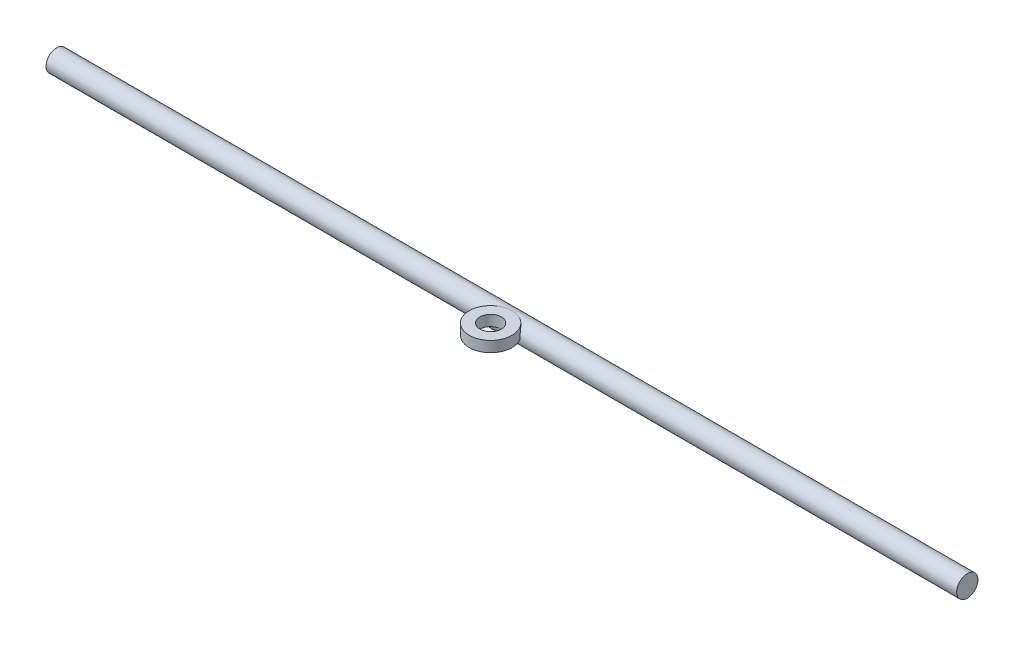
ISO-10303-21;
HEADER;
FILE_DESCRIPTION(('STEP AP214'),'2;1');
FILE_NAME('part.step','',(''),(''),'','','');
FILE_SCHEMA(('AUTOMOTIVE_DESIGN { 1 0 10303 214 1 1 1 1 }'));
ENDSEC;
DATA;
#1=APPLICATION_CONTEXT('core data for automotive mechanical design processes');
#2=APPLICATION_PROTOCOL_DEFINITION('international standard','automotive_design',2000,#1);
#3=PRODUCT_CONTEXT('',#1,'mechanical');
#4=PRODUCT('Part','Part','',(#3));
#5=PRODUCT_RELATED_PRODUCT_CATEGORY('part','',(#4));
#6=PRODUCT_DEFINITION_FORMATION('','',#4);
#7=PRODUCT_DEFINITION_CONTEXT('part definition',#1,'design');
#8=PRODUCT_DEFINITION('design','',#6,#7);
#9=PRODUCT_DEFINITION_SHAPE('','',#8);
#10=(LENGTH_UNIT() NAMED_UNIT(*) SI_UNIT(.MILLI.,.METRE.));
#11=(NAMED_UNIT(*) PLANE_ANGLE_UNIT() SI_UNIT($,.RADIAN.));
#12=(NAMED_UNIT(*) SI_UNIT($,.STERADIAN.) SOLID_ANGLE_UNIT());
#13=UNCERTAINTY_MEASURE_WITH_UNIT(LENGTH_MEASURE(1.E-05),#10,'distance_accuracy_value','');
#14=(GEOMETRIC_REPRESENTATION_CONTEXT(3) GLOBAL_UNCERTAINTY_ASSIGNED_CONTEXT((#13)) GLOBAL_UNIT_ASSIGNED_CONTEXT((#10,
#11,#12)) REPRESENTATION_CONTEXT('',''));
#15=CARTESIAN_POINT('',(0.,0.,0.));
#16=DIRECTION('',(0.,0.,1.));
#17=DIRECTION('',(1.,0.,0.));
#18=AXIS2_PLACEMENT_3D('',#15,#16,#17);
#19=CARTESIAN_POINT('',(-213.333333333333,0.,0.));
#20=DIRECTION('',(1.,0.,0.));
#21=DIRECTION('',(0.,0.,-1.));
#22=AXIS2_PLACEMENT_3D('',#19,#20,#21);
#23=CYLINDRICAL_SURFACE('',#22,5.);
#24=CARTESIAN_POINT('',(213.333333333333,0.,0.));
#25=DIRECTION('',(1.,0.,0.));
#26=DIRECTION('',(0.,0.,-1.));
#27=AXIS2_PLACEMENT_3D('',#24,#25,#26);
#28=CIRCLE('',#27,5.);
#29=CARTESIAN_POINT('',(213.333333333333,0.,-5.));
#30=VERTEX_POINT('',#29);
#31=EDGE_CURVE('E89',#30,#30,#28,.T.);
#32=ORIENTED_EDGE('',*,*,#31,.F.);
#33=EDGE_LOOP('',(#32));
#34=FACE_BOUND('',#33,.T.);
#35=CARTESIAN_POINT('',(-213.333333333333,0.,0.));
#36=DIRECTION('',(1.,0.,0.));
#37=DIRECTION('',(0.,0.,-1.));
#38=AXIS2_PLACEMENT_3D('',#35,#36,#37);
#39=CIRCLE('',#38,5.);
#40=CARTESIAN_POINT('',(-213.333333333333,0.,-5.));
#41=VERTEX_POINT('',#40);
#42=EDGE_CURVE('E135',#41,#41,#39,.T.);
#43=ORIENTED_EDGE('',*,*,#42,.T.);
#44=EDGE_LOOP('',(#43));
#45=FACE_BOUND('',#44,.T.);
#46=CARTESIAN_POINT('',(0.,5.,0.));
#47=CARTESIAN_POINT('',(0.139800140532805,4.99998914216106,-1.64953411774006E-06));
#48=CARTESIAN_POINT('',(0.279599008612205,4.99999971712435,0.00293161128916269));
#49=CARTESIAN_POINT('',(0.558951182691962,4.99998481796157,0.0146552817651165));
#50=CARTESIAN_POINT('',(0.698504488279619,4.99995934377498,0.0234457012520745));
#51=CARTESIAN_POINT('',(0.977171774875295,4.99979340151413,0.0468751978808742));
#52=CARTESIAN_POINT('',(1.11628558128742,4.99965289239646,0.0615163615597334));
#53=CARTESIAN_POINT('',(1.39376674870488,4.99909670772593,0.096617866777976));
#54=CARTESIAN_POINT('',(1.53213411181994,4.99868103295118,0.117078191861396));
#55=CARTESIAN_POINT('',(1.94736630640988,4.99671275391144,0.187413617385381));
#56=CARTESIAN_POINT('',(2.22278832364154,4.99443550926618,0.246111117331495));
#57=CARTESIAN_POINT('',(2.76755428049912,4.98553578349395,0.386481190947482));
#58=CARTESIAN_POINT('',(3.03689988080349,4.97891450484001,0.46814740306997));
#59=CARTESIAN_POINT('',(3.51745927684456,4.95992802984724,0.636266400188529));
#60=CARTESIAN_POINT('',(3.73006013603067,4.94888089289344,0.718914864376468));
#61=CARTESIAN_POINT('',(4.14872659779974,4.91947428900589,0.89835629569658));
#62=CARTESIAN_POINT('',(4.35479211064774,4.90111472171414,0.99514945694328));
#63=CARTESIAN_POINT('',(4.7583706125626,4.8545819563223,1.20175346244203));
#64=CARTESIAN_POINT('',(4.95590782245111,4.82643893209432,1.31152360430033));
#65=CARTESIAN_POINT('',(5.34147781162199,4.75745956206622,1.54310240884557));
#66=CARTESIAN_POINT('',(5.52951406874083,4.71662790067116,1.66490661748192));
#67=CARTESIAN_POINT('',(5.84244241215245,4.63303893159044,1.88266017635314));
#68=CARTESIAN_POINT('',(5.97009861226641,4.59412330902775,1.97612550752586));
#69=CARTESIAN_POINT('',(6.21886389016391,4.50706149141273,2.16735554517715));
#70=CARTESIAN_POINT('',(6.33997461979957,4.45891763932518,2.26511915551634));
#71=CARTESIAN_POINT('',(6.57478233010431,4.3523420225593,2.46369710064056));
#72=CARTESIAN_POINT('',(6.68848555757562,4.29391908432197,2.56450875711478));
#73=CARTESIAN_POINT('',(6.90778050525223,4.16578673061267,2.76778695237177));
#74=CARTESIAN_POINT('',(7.01337355959722,4.09607917737088,2.87025321559762));
#75=CARTESIAN_POINT('',(7.19884885497205,3.95723959257726,3.05802689584982));
#76=CARTESIAN_POINT('',(7.28008612893296,3.88994068678859,3.1433532868894));
#77=CARTESIAN_POINT('',(7.43599218655022,3.74672632750304,3.31275366062449));
#78=CARTESIAN_POINT('',(7.51066226186664,3.67081257516241,3.39682788688594));
#79=CARTESIAN_POINT('',(7.6531098780371,3.51028955668752,3.56246605522402));
#80=CARTESIAN_POINT('',(7.72088831242561,3.42568142068943,3.6440303217703));
#81=CARTESIAN_POINT('',(7.84932950522482,3.247890318759,3.80334775638808));
#82=CARTESIAN_POINT('',(7.90999216887631,3.15470723866546,3.8811008736993));
#83=CARTESIAN_POINT('',(8.02432408426386,2.95968058802516,4.03181652705226));
#84=CARTESIAN_POINT('',(8.07796079140625,2.85780009224932,4.10475604324047));
#85=CARTESIAN_POINT('',(8.17789455229584,2.64630545640413,4.24418533332557));
#86=CARTESIAN_POINT('',(8.2241913903903,2.53669108924253,4.31067491769469));
#87=CARTESIAN_POINT('',(8.30953242981146,2.31043481699848,4.43605992756374));
#88=CARTESIAN_POINT('',(8.3485731099945,2.19378953624449,4.49495166189195));
#89=CARTESIAN_POINT('',(8.41951139462065,1.95444091978436,4.60406938899334));
#90=CARTESIAN_POINT('',(8.4514097901313,1.83173825682289,4.65429634132172));
#91=CARTESIAN_POINT('',(8.50586855798514,1.59179039811977,4.74142474898931));
#92=CARTESIAN_POINT('',(8.52898701294493,1.47494787963083,4.77908962519889));
#93=CARTESIAN_POINT('',(8.56952899116471,1.23789037463573,4.8459043283864));
#94=CARTESIAN_POINT('',(8.58695281871964,1.11767556870211,4.87505461033661));
#95=CARTESIAN_POINT('',(8.61620888787173,0.875007662598516,4.92439504671448));
#96=CARTESIAN_POINT('',(8.6280519895824,0.752559395383316,4.94460259902243));
#97=CARTESIAN_POINT('',(8.64629291893926,0.506152900605519,4.97586328576335));
#98=CARTESIAN_POINT('',(8.65269409199955,0.382195648302573,4.98692204428533));
#99=CARTESIAN_POINT('',(8.657690107507,0.214989709339041,4.99556148052155));
#100=CARTESIAN_POINT('',(8.65865233930065,0.17198570423535,4.99722669885626));
#101=CARTESIAN_POINT('',(8.65993382375217,0.0859894305317277,4.9994451891233));
#102=CARTESIAN_POINT('',(8.66025382182277,0.0429972063007321,4.99999975014563));
#103=CARTESIAN_POINT('',(8.66025403784456,0.,5.));
#104=B_SPLINE_CURVE_WITH_KNOTS('',3,(#46,#47,#48,#49,#50,#51,#52,#53,#54,#55,#56,#57,#58,#59,
#60,#61,#62,#63,#64,#65,#66,#67,#68,#69,#70,#71,#72,#73,#74,#75,#76,#77,#78,#79,#80,#81,#82,#83,
#84,#85,#86,#87,#88,#89,#90,#91,#92,#93,#94,#95,#96,#97,#98,#99,#100,#101,#102,#103),
.UNSPECIFIED.,.F.,.F.,(4,2,2,2,2,2,2,2,2,2,2,2,2,2,2,2,2,2,2,2,2,2,2,2,2,2,2,2,4),(0.,
0.41936718061986,0.838735065367234,1.25825264195099,1.67776903219588,2.52152207908425,
3.36504166498959,4.04955146499342,4.73407065973913,5.41649713945005,6.09867197890897,
6.58706888878977,7.075341962924,7.56319779516843,8.05097320149911,8.45760945728659,
8.86416555470606,9.27066887277155,9.67717760354036,10.0855073091988,10.4938490097727,
10.9023883489688,11.3108824166217,11.6851895816918,12.0594767422209,12.4330324995092,
12.8063584477875,12.9354852963143,13.0644621860571),.UNSPECIFIED.);
#105=CARTESIAN_POINT('',(0.,5.,0.));
#106=VERTEX_POINT('',#105);
#107=CARTESIAN_POINT('',(8.66025403784439,0.,5.));
#108=VERTEX_POINT('',#107);
#109=EDGE_CURVE('E80',#106,#108,#104,.T.);
#110=ORIENTED_EDGE('',*,*,#109,.T.);
#111=DIRECTION('',(1.,0.,0.));
#112=VECTOR('',#111,1.);
#113=CARTESIAN_POINT('',(-213.333333333333,0.,5.));
#114=LINE('',#113,#112);
#115=CARTESIAN_POINT('',(0.,0.,5.));
#116=VERTEX_POINT('',#115);
#117=EDGE_CURVE('E12',#108,#116,#114,.F.);
#118=ORIENTED_EDGE('',*,*,#117,.T.);
#119=CARTESIAN_POINT('',(-8.66025403784439,0.,5.));
#120=VERTEX_POINT('',#119);
#121=EDGE_CURVE('E49',#116,#120,#114,.F.);
#122=ORIENTED_EDGE('',*,*,#121,.T.);
#123=CARTESIAN_POINT('',(-8.66025403784439,0.,5.));
#124=CARTESIAN_POINT('',(-8.66024609326101,0.122492872011071,5.0000205346112));
#125=CARTESIAN_POINT('',(-8.65765505794739,0.244983766188433,4.99549950915938));
#126=CARTESIAN_POINT('',(-8.64724881983724,0.489077620313457,4.97752179271196));
#127=CARTESIAN_POINT('',(-8.63943393219399,0.610680633379317,4.9640656407699));
#128=CARTESIAN_POINT('',(-8.61853622828838,0.851965647314818,4.92838935511424));
#129=CARTESIAN_POINT('',(-8.60546058666182,0.971650034580792,4.90618115831345));
#130=CARTESIAN_POINT('',(-8.57393518361783,1.20840868356319,4.85329341696936));
#131=CARTESIAN_POINT('',(-8.55548550149033,1.32548298376205,4.82261399741292));
#132=CARTESIAN_POINT('',(-8.51307609535753,1.55623397403235,4.75317356172158));
#133=CARTESIAN_POINT('',(-8.48911435274261,1.66990940210354,4.71440958537221));
#134=CARTESIAN_POINT('',(-8.43553673536373,1.89306592665629,4.62931594614087));
#135=CARTESIAN_POINT('',(-8.4059187895839,2.00254546913211,4.58298351297385));
#136=CARTESIAN_POINT('',(-8.34092981062878,2.21645174193167,4.48344150135111));
#137=CARTESIAN_POINT('',(-8.30556300299918,2.32088211091487,4.43023697989354));
#138=CARTESIAN_POINT('',(-8.22894758504274,2.5241571178733,4.31765390155602));
#139=CARTESIAN_POINT('',(-8.18769681261962,2.6229996838533,4.25827307734025));
#140=CARTESIAN_POINT('',(-8.09903364722441,2.81501324562833,4.13386704003586));
#141=CARTESIAN_POINT('',(-8.05158954351588,2.9081511555277,4.06881339322608));
#142=CARTESIAN_POINT('',(-7.95070439285662,3.08776775580658,3.934245797638));
#143=CARTESIAN_POINT('',(-7.89726120332706,3.17424404827042,3.86473025911102));
#144=CARTESIAN_POINT('',(-7.7844698043468,3.34019265044049,3.72223978823389));
#145=CARTESIAN_POINT('',(-7.72512219697667,3.41966567272328,3.64926520900277));
#146=CARTESIAN_POINT('',(-7.6006695362958,3.57148365468618,3.50082787404027));
#147=CARTESIAN_POINT('',(-7.53556237419423,3.64382598288173,3.42536421335717));
#148=CARTESIAN_POINT('',(-7.32356703163396,3.8585092709771,3.18736049649492));
#149=CARTESIAN_POINT('',(-7.16685505152501,3.98835809863385,3.02208508321891));
#150=CARTESIAN_POINT('',(-6.83123914842219,4.21747080538094,2.69319024898048));
#151=CARTESIAN_POINT('',(-6.65232657697629,4.31672271235576,2.52957150040324));
#152=CARTESIAN_POINT('',(-6.32251815981267,4.46714630032472,2.2501431300979));
#153=CARTESIAN_POINT('',(-6.17570542801059,4.52413694981026,2.13255512477259));
#154=CARTESIAN_POINT('',(-5.87273200558984,4.6250230534476,1.90388777170022));
#155=CARTESIAN_POINT('',(-5.71656748012134,4.66891309072444,1.79281113150178));
#156=CARTESIAN_POINT('',(-5.39583792277488,4.74567639158581,1.57846533124136));
#157=CARTESIAN_POINT('',(-5.23125308274322,4.77852215882001,1.47521614608058));
#158=CARTESIAN_POINT('',(-4.89519375882405,4.83502884645017,1.27789792153273));
#159=CARTESIAN_POINT('',(-4.72371931275061,4.85868981724991,1.1838288317698));
#160=CARTESIAN_POINT('',(-4.31565989663792,4.90546995887911,0.975374644267924));
#161=CARTESIAN_POINT('',(-4.07672323953897,4.92568153229488,0.864925476255115));
#162=CARTESIAN_POINT('',(-3.59032723427271,4.95689629301643,0.663032484964266));
#163=CARTESIAN_POINT('',(-3.34286449786806,4.96789577447789,0.571596321353916));
#164=CARTESIAN_POINT('',(-2.84143302834591,4.98395300501167,0.408559722270843));
#165=CARTESIAN_POINT('',(-2.58746716337712,4.98901332890135,0.336950701384856));
#166=CARTESIAN_POINT('',(-2.07475277575824,4.99579522983428,0.214046618844069));
#167=CARTESIAN_POINT('',(-1.8160062767403,4.99751818830693,0.162743159146422));
#168=CARTESIAN_POINT('',(-1.29811990899362,4.99950623095752,0.081188733891475));
#169=CARTESIAN_POINT('',(-1.03901607386518,4.99978723592213,0.0507110987821472));
#170=CARTESIAN_POINT('',(-0.649577437362651,4.9999675899264,0.0202725410306355));
#171=CARTESIAN_POINT('',(-0.51979859863425,4.99998764197566,0.012672670048666));
#172=CARTESIAN_POINT('',(-0.260017705977503,5.00000079268923,0.00253594924927664));
#173=CARTESIAN_POINT('',(-0.130015613089033,4.99999388603929,9.78284804091823E-08));
#174=CARTESIAN_POINT('',(0.,5.,0.));
#175=B_SPLINE_CURVE_WITH_KNOTS('',3,(#123,#124,#125,#126,#127,#128,#129,#130,#131,#132,#133,
#134,#135,#136,#137,#138,#139,#140,#141,#142,#143,#144,#145,#146,#147,#148,#149,#150,#151,#152,
#153,#154,#155,#156,#157,#158,#159,#160,#161,#162,#163,#164,#165,#166,#167,#168,#169,#170,#171,
#172,#173,#174),.UNSPECIFIED.,.F.,.F.,(4,2,2,2,2,2,2,2,2,2,2,2,2,2,2,2,2,2,2,2,2,2,2,2,2,4),(0.,
0.367365046180228,0.73470793134975,1.10155152200076,1.46838970042477,1.83536243566214,
2.202469796296,2.56930853468129,2.9362824189702,3.30521491579451,3.67427959895871,
4.04330668665212,4.41246945281553,5.19567285960974,5.97918233429422,6.56802809355305,
7.15711699406712,7.74766184353557,8.33820345220079,9.12910897921245,9.92033251942286,
10.7112129117222,11.5017658663716,12.2835711539707,12.6734893943441,13.0634845014498),.UNSPECIFIED.);
#176=EDGE_CURVE('E82',#120,#106,#175,.T.);
#177=ORIENTED_EDGE('',*,*,#176,.T.);
#178=EDGE_LOOP('',(#110,#118,#122,#177));
#179=FACE_BOUND('',#178,.T.);
#180=ADVANCED_FACE('F45',(#34,#45,#179),#23,.T.);
#181=CARTESIAN_POINT('',(-213.333333333333,0.,0.));
#182=DIRECTION('',(1.,0.,0.));
#183=DIRECTION('',(0.,0.,-1.));
#184=AXIS2_PLACEMENT_3D('',#181,#182,#183);
#185=PLANE('',#184);
#186=ORIENTED_EDGE('',*,*,#42,.F.);
#187=EDGE_LOOP('',(#186));
#188=FACE_BOUND('',#187,.T.);
#189=ADVANCED_FACE('F47',(#188),#185,.F.);
#190=CARTESIAN_POINT('',(213.333333333333,0.,0.));
#191=DIRECTION('',(1.,0.,0.));
#192=DIRECTION('',(0.,0.,-1.));
#193=AXIS2_PLACEMENT_3D('',#190,#191,#192);
#194=PLANE('',#193);
#195=ORIENTED_EDGE('',*,*,#31,.T.);
#196=EDGE_LOOP('',(#195));
#197=FACE_BOUND('',#196,.T.);
#198=ADVANCED_FACE('F113',(#197),#194,.T.);
#199=CARTESIAN_POINT('',(0.,5.,10.));
#200=DIRECTION('',(0.,1.,0.));
#201=DIRECTION('',(0.,0.,1.));
#202=AXIS2_PLACEMENT_3D('',#199,#200,#201);
#203=PLANE('',#202);
#204=CARTESIAN_POINT('',(0.,5.,10.));
#205=DIRECTION('',(0.,1.,0.));
#206=DIRECTION('',(0.,0.,1.));
#207=AXIS2_PLACEMENT_3D('',#204,#205,#206);
#208=CIRCLE('',#207,10.);
#209=EDGE_CURVE('E61',#106,#106,#208,.T.);
#210=ORIENTED_EDGE('',*,*,#209,.T.);
#211=EDGE_LOOP('',(#210));
#212=FACE_BOUND('',#211,.T.);
#213=CARTESIAN_POINT('',(0.,5.,10.));
#214=DIRECTION('',(0.,1.,0.));
#215=DIRECTION('',(0.,0.,1.));
#216=AXIS2_PLACEMENT_3D('',#213,#214,#215);
#217=CIRCLE('',#216,5.);
#218=CARTESIAN_POINT('',(0.,5.,15.));
#219=VERTEX_POINT('',#218);
#220=EDGE_CURVE('E84',#219,#219,#217,.T.);
#221=ORIENTED_EDGE('',*,*,#220,.F.);
#222=EDGE_LOOP('',(#221));
#223=FACE_BOUND('',#222,.T.);
#224=ADVANCED_FACE('F110',(#212,#223),#203,.T.);
#225=CARTESIAN_POINT('',(0.,0.,10.));
#226=DIRECTION('',(0.,1.,0.));
#227=DIRECTION('',(0.,0.,1.));
#228=AXIS2_PLACEMENT_3D('',#225,#226,#227);
#229=PLANE('',#228);
#230=ORIENTED_EDGE('',*,*,#117,.F.);
#231=CARTESIAN_POINT('',(0.,0.,10.));
#232=DIRECTION('',(0.,1.,0.));
#233=DIRECTION('',(0.,0.,1.));
#234=AXIS2_PLACEMENT_3D('',#231,#232,#233);
#235=CIRCLE('',#234,10.);
#236=EDGE_CURVE('E74',#120,#108,#235,.T.);
#237=ORIENTED_EDGE('',*,*,#236,.F.);
#238=ORIENTED_EDGE('',*,*,#121,.F.);
#239=CARTESIAN_POINT('',(0.,0.,10.));
#240=DIRECTION('',(0.,1.,0.));
#241=DIRECTION('',(0.,0.,1.));
#242=AXIS2_PLACEMENT_3D('',#239,#240,#241);
#243=CIRCLE('',#242,5.);
#244=EDGE_CURVE('E76',#116,#116,#243,.T.);
#245=ORIENTED_EDGE('',*,*,#244,.T.);
#246=EDGE_LOOP('',(#230,#237,#238,#245));
#247=FACE_BOUND('',#246,.T.);
#248=ADVANCED_FACE('F73',(#247),#229,.F.);
#249=CARTESIAN_POINT('',(0.,5.,10.));
#250=DIRECTION('',(0.,-1.,0.));
#251=DIRECTION('',(0.,0.,-1.));
#252=AXIS2_PLACEMENT_3D('',#249,#250,#251);
#253=CYLINDRICAL_SURFACE('',#252,10.);
#254=ORIENTED_EDGE('',*,*,#109,.F.);
#255=ORIENTED_EDGE('',*,*,#209,.F.);
#256=ORIENTED_EDGE('',*,*,#176,.F.);
#257=ORIENTED_EDGE('',*,*,#236,.T.);
#258=EDGE_LOOP('',(#254,#255,#256,#257));
#259=FACE_BOUND('',#258,.T.);
#260=ADVANCED_FACE('F79',(#259),#253,.T.);
#261=CARTESIAN_POINT('',(0.,5.,10.));
#262=DIRECTION('',(0.,-1.,0.));
#263=DIRECTION('',(0.,0.,-1.));
#264=AXIS2_PLACEMENT_3D('',#261,#262,#263);
#265=CYLINDRICAL_SURFACE('',#264,5.);
#266=ORIENTED_EDGE('',*,*,#220,.T.);
#267=EDGE_LOOP('',(#266));
#268=FACE_BOUND('',#267,.T.);
#269=ORIENTED_EDGE('',*,*,#244,.F.);
#270=EDGE_LOOP('',(#269));
#271=FACE_BOUND('',#270,.T.);
#272=ADVANCED_FACE('F106',(#268,#271),#265,.F.);
#273=CLOSED_SHELL('',(#180,#189,#198,#224,#248,#260,#272));
#274=MANIFOLD_SOLID_BREP('B2',#273);
#275=ADVANCED_BREP_SHAPE_REPRESENTATION('',(#18,#274),#14);
#276=SHAPE_DEFINITION_REPRESENTATION(#9,#275);
ENDSEC;
END-ISO-10303-21;
